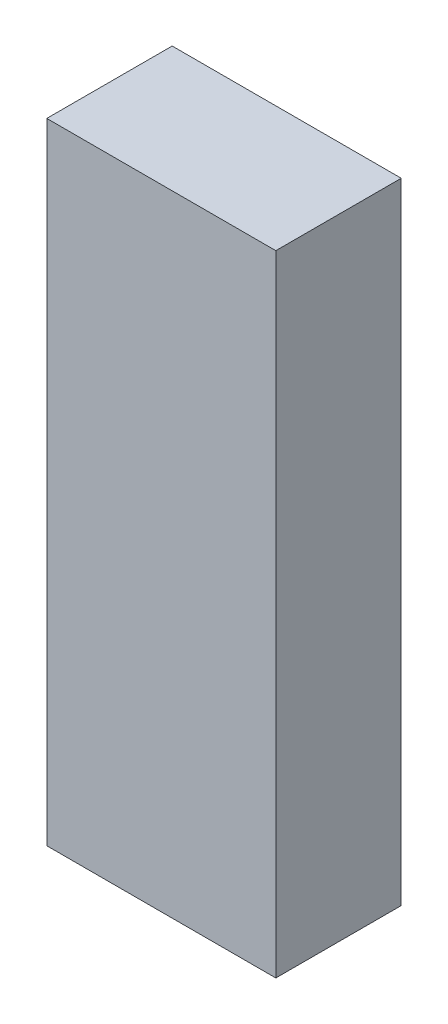
ISO-10303-21;
HEADER;
FILE_DESCRIPTION(('STEP AP214'),'2;1');
FILE_NAME('part.step','',(''),(''),'','','');
FILE_SCHEMA(('AUTOMOTIVE_DESIGN { 1 0 10303 214 1 1 1 1 }'));
ENDSEC;
DATA;
#1=APPLICATION_CONTEXT('core data for automotive mechanical design processes');
#2=APPLICATION_PROTOCOL_DEFINITION('international standard','automotive_design',2000,#1);
#3=PRODUCT_CONTEXT('',#1,'mechanical');
#4=PRODUCT('Part','Part','',(#3));
#5=PRODUCT_RELATED_PRODUCT_CATEGORY('part','',(#4));
#6=PRODUCT_DEFINITION_FORMATION('','',#4);
#7=PRODUCT_DEFINITION_CONTEXT('part definition',#1,'design');
#8=PRODUCT_DEFINITION('design','',#6,#7);
#9=PRODUCT_DEFINITION_SHAPE('','',#8);
#10=(LENGTH_UNIT() NAMED_UNIT(*) SI_UNIT(.MILLI.,.METRE.));
#11=(NAMED_UNIT(*) PLANE_ANGLE_UNIT() SI_UNIT($,.RADIAN.));
#12=(NAMED_UNIT(*) SI_UNIT($,.STERADIAN.) SOLID_ANGLE_UNIT());
#13=UNCERTAINTY_MEASURE_WITH_UNIT(LENGTH_MEASURE(1.E-05),#10,'distance_accuracy_value','');
#14=(GEOMETRIC_REPRESENTATION_CONTEXT(3) GLOBAL_UNCERTAINTY_ASSIGNED_CONTEXT((#13)) GLOBAL_UNIT_ASSIGNED_CONTEXT((#10,
#11,#12)) REPRESENTATION_CONTEXT('',''));
#15=CARTESIAN_POINT('',(0.,0.,0.));
#16=DIRECTION('',(0.,0.,1.));
#17=DIRECTION('',(1.,0.,0.));
#18=AXIS2_PLACEMENT_3D('',#15,#16,#17);
#19=CARTESIAN_POINT('',(0.1999996,0.55000144,0.2189988));
#20=DIRECTION('',(0.,0.,-1.));
#21=DIRECTION('',(-1.,0.,0.));
#22=AXIS2_PLACEMENT_3D('',#19,#20,#21);
#23=PLANE('',#22);
#24=DIRECTION('',(0.,1.,0.));
#25=VECTOR('',#24,1.);
#26=CARTESIAN_POINT('',(-0.1999996,0.55000144,0.2189988));
#27=LINE('',#26,#25);
#28=CARTESIAN_POINT('',(-0.1999996,0.55000144,0.2189988));
#29=VERTEX_POINT('',#28);
#30=CARTESIAN_POINT('',(-0.1999996,-0.5499989,0.2189988));
#31=VERTEX_POINT('',#30);
#32=EDGE_CURVE('E55',#29,#31,#27,.F.);
#33=ORIENTED_EDGE('',*,*,#32,.T.);
#34=DIRECTION('',(1.,0.,0.));
#35=VECTOR('',#34,1.);
#36=CARTESIAN_POINT('',(-0.1999996,-0.5499989,0.2189988));
#37=LINE('',#36,#35);
#38=CARTESIAN_POINT('',(0.1999996,-0.5499989,0.2189988));
#39=VERTEX_POINT('',#38);
#40=EDGE_CURVE('E57',#31,#39,#37,.T.);
#41=ORIENTED_EDGE('',*,*,#40,.T.);
#42=DIRECTION('',(0.,1.,0.));
#43=VECTOR('',#42,1.);
#44=CARTESIAN_POINT('',(0.1999996,-0.5499989,0.2189988));
#45=LINE('',#44,#43);
#46=CARTESIAN_POINT('',(0.1999996,0.55000144,0.2189988));
#47=VERTEX_POINT('',#46);
#48=EDGE_CURVE('E20',#39,#47,#45,.T.);
#49=ORIENTED_EDGE('',*,*,#48,.T.);
#50=DIRECTION('',(1.,0.,0.));
#51=VECTOR('',#50,1.);
#52=CARTESIAN_POINT('',(0.1999996,0.55000144,0.2189988));
#53=LINE('',#52,#51);
#54=EDGE_CURVE('E80',#47,#29,#53,.F.);
#55=ORIENTED_EDGE('',*,*,#54,.T.);
#56=EDGE_LOOP('',(#33,#41,#49,#55));
#57=FACE_BOUND('',#56,.T.);
#58=ADVANCED_FACE('F17',(#57),#23,.F.);
#59=CARTESIAN_POINT('',(0.1999996,-0.5499989,0.));
#60=DIRECTION('',(-1.,0.,0.));
#61=DIRECTION('',(0.,0.,1.));
#62=AXIS2_PLACEMENT_3D('',#59,#60,#61);
#63=PLANE('',#62);
#64=DIRECTION('',(0.,0.,-1.));
#65=VECTOR('',#64,1.);
#66=CARTESIAN_POINT('',(0.1999996,0.55000144,0.));
#67=LINE('',#66,#65);
#68=CARTESIAN_POINT('',(0.1999996,0.55000144,0.));
#69=VERTEX_POINT('',#68);
#70=EDGE_CURVE('E68',#69,#47,#67,.F.);
#71=ORIENTED_EDGE('',*,*,#70,.T.);
#72=ORIENTED_EDGE('',*,*,#48,.F.);
#73=DIRECTION('',(0.,0.,1.));
#74=VECTOR('',#73,1.);
#75=CARTESIAN_POINT('',(0.1999996,-0.5499989,0.));
#76=LINE('',#75,#74);
#77=CARTESIAN_POINT('',(0.1999996,-0.5499989,0.));
#78=VERTEX_POINT('',#77);
#79=EDGE_CURVE('E63',#39,#78,#76,.F.);
#80=ORIENTED_EDGE('',*,*,#79,.T.);
#81=DIRECTION('',(0.,1.,0.));
#82=VECTOR('',#81,1.);
#83=CARTESIAN_POINT('',(0.1999996,0.55000144,0.));
#84=LINE('',#83,#82);
#85=EDGE_CURVE('E83',#69,#78,#84,.F.);
#86=ORIENTED_EDGE('',*,*,#85,.F.);
#87=EDGE_LOOP('',(#71,#72,#80,#86));
#88=FACE_BOUND('',#87,.T.);
#89=ADVANCED_FACE('F65',(#88),#63,.F.);
#90=CARTESIAN_POINT('',(-0.1999996,-0.5499989,0.));
#91=DIRECTION('',(0.,1.,0.));
#92=DIRECTION('',(0.,0.,1.));
#93=AXIS2_PLACEMENT_3D('',#90,#91,#92);
#94=PLANE('',#93);
#95=ORIENTED_EDGE('',*,*,#79,.F.);
#96=ORIENTED_EDGE('',*,*,#40,.F.);
#97=DIRECTION('',(0.,0.,-1.));
#98=VECTOR('',#97,1.);
#99=CARTESIAN_POINT('',(-0.1999996,-0.5499989,0.));
#100=LINE('',#99,#98);
#101=CARTESIAN_POINT('',(-0.1999996,-0.5499989,0.));
#102=VERTEX_POINT('',#101);
#103=EDGE_CURVE('E75',#31,#102,#100,.T.);
#104=ORIENTED_EDGE('',*,*,#103,.T.);
#105=DIRECTION('',(-1.,0.,0.));
#106=VECTOR('',#105,1.);
#107=CARTESIAN_POINT('',(0.1999996,-0.5499989,0.));
#108=LINE('',#107,#106);
#109=EDGE_CURVE('E72',#78,#102,#108,.T.);
#110=ORIENTED_EDGE('',*,*,#109,.F.);
#111=EDGE_LOOP('',(#95,#96,#104,#110));
#112=FACE_BOUND('',#111,.T.);
#113=ADVANCED_FACE('F70',(#112),#94,.F.);
#114=CARTESIAN_POINT('',(-0.1999996,0.55000144,0.));
#115=DIRECTION('',(1.,0.,0.));
#116=DIRECTION('',(0.,0.,-1.));
#117=AXIS2_PLACEMENT_3D('',#114,#115,#116);
#118=PLANE('',#117);
#119=ORIENTED_EDGE('',*,*,#103,.F.);
#120=ORIENTED_EDGE('',*,*,#32,.F.);
#121=DIRECTION('',(0.,0.,-1.));
#122=VECTOR('',#121,1.);
#123=CARTESIAN_POINT('',(-0.1999996,0.55000144,0.));
#124=LINE('',#123,#122);
#125=CARTESIAN_POINT('',(-0.1999996,0.55000144,0.));
#126=VERTEX_POINT('',#125);
#127=EDGE_CURVE('E35',#29,#126,#124,.T.);
#128=ORIENTED_EDGE('',*,*,#127,.T.);
#129=DIRECTION('',(0.,1.,0.));
#130=VECTOR('',#129,1.);
#131=CARTESIAN_POINT('',(-0.1999996,0.55000144,0.));
#132=LINE('',#131,#130);
#133=EDGE_CURVE('E26',#102,#126,#132,.T.);
#134=ORIENTED_EDGE('',*,*,#133,.F.);
#135=EDGE_LOOP('',(#119,#120,#128,#134));
#136=FACE_BOUND('',#135,.T.);
#137=ADVANCED_FACE('F89',(#136),#118,.F.);
#138=CARTESIAN_POINT('',(0.1999996,0.55000144,0.));
#139=DIRECTION('',(0.,-1.,0.));
#140=DIRECTION('',(0.,0.,-1.));
#141=AXIS2_PLACEMENT_3D('',#138,#139,#140);
#142=PLANE('',#141);
#143=ORIENTED_EDGE('',*,*,#127,.F.);
#144=ORIENTED_EDGE('',*,*,#54,.F.);
#145=ORIENTED_EDGE('',*,*,#70,.F.);
#146=DIRECTION('',(-1.,0.,0.));
#147=VECTOR('',#146,1.);
#148=CARTESIAN_POINT('',(0.1999996,0.55000144,0.));
#149=LINE('',#148,#147);
#150=EDGE_CURVE('E11',#126,#69,#149,.F.);
#151=ORIENTED_EDGE('',*,*,#150,.F.);
#152=EDGE_LOOP('',(#143,#144,#145,#151));
#153=FACE_BOUND('',#152,.T.);
#154=ADVANCED_FACE('F91',(#153),#142,.F.);
#155=CARTESIAN_POINT('',(0.1999996,0.55000144,0.));
#156=DIRECTION('',(0.,0.,-1.));
#157=DIRECTION('',(-1.,0.,0.));
#158=AXIS2_PLACEMENT_3D('',#155,#156,#157);
#159=PLANE('',#158);
#160=ORIENTED_EDGE('',*,*,#133,.T.);
#161=ORIENTED_EDGE('',*,*,#150,.T.);
#162=ORIENTED_EDGE('',*,*,#85,.T.);
#163=ORIENTED_EDGE('',*,*,#109,.T.);
#164=EDGE_LOOP('',(#160,#161,#162,#163));
#165=FACE_BOUND('',#164,.T.);
#166=ADVANCED_FACE('F88',(#165),#159,.T.);
#167=CLOSED_SHELL('',(#58,#89,#113,#137,#154,#166));
#168=MANIFOLD_SOLID_BREP('B1',#167);
#169=ADVANCED_BREP_SHAPE_REPRESENTATION('',(#18,#168),#14);
#170=SHAPE_DEFINITION_REPRESENTATION(#9,#169);
ENDSEC;
END-ISO-10303-21;
